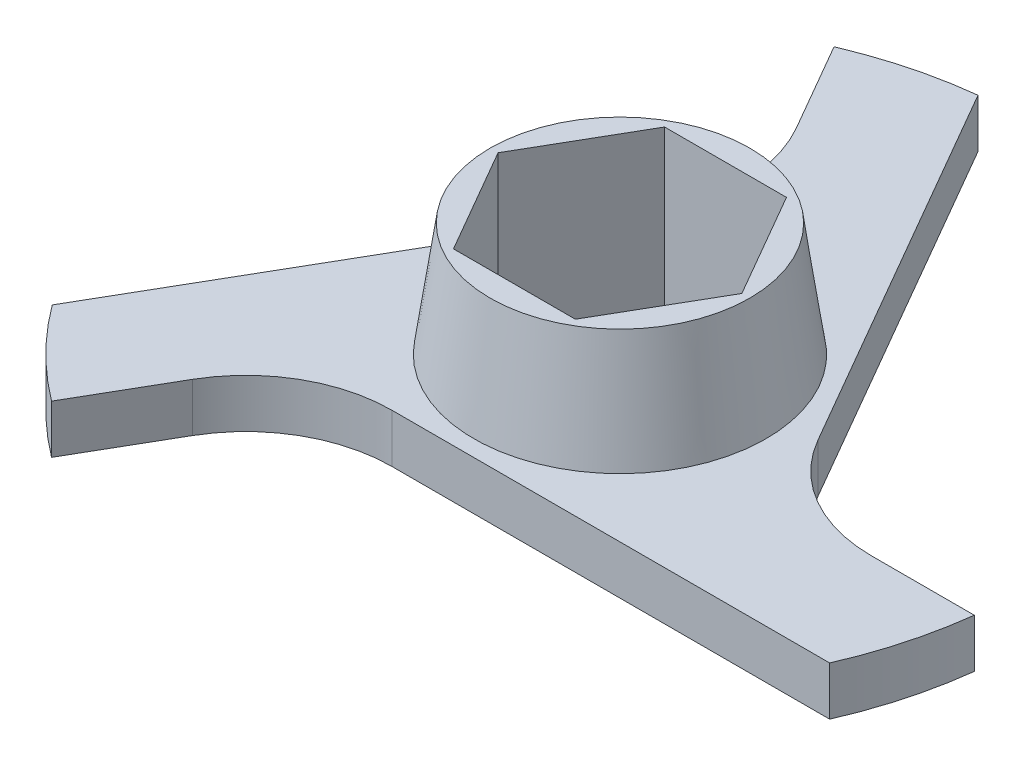
ISO-10303-21;
HEADER;
FILE_DESCRIPTION(('STEP AP214'),'2;1');
FILE_NAME('part.step','',(''),(''),'','','');
FILE_SCHEMA(('AUTOMOTIVE_DESIGN { 1 0 10303 214 1 1 1 1 }'));
ENDSEC;
DATA;
#1=APPLICATION_CONTEXT('core data for automotive mechanical design processes');
#2=APPLICATION_PROTOCOL_DEFINITION('international standard','automotive_design',2000,#1);
#3=PRODUCT_CONTEXT('',#1,'mechanical');
#4=PRODUCT('Part','Part','',(#3));
#5=PRODUCT_RELATED_PRODUCT_CATEGORY('part','',(#4));
#6=PRODUCT_DEFINITION_FORMATION('','',#4);
#7=PRODUCT_DEFINITION_CONTEXT('part definition',#1,'design');
#8=PRODUCT_DEFINITION('design','',#6,#7);
#9=PRODUCT_DEFINITION_SHAPE('','',#8);
#10=(LENGTH_UNIT() NAMED_UNIT(*) SI_UNIT(.MILLI.,.METRE.));
#11=(NAMED_UNIT(*) PLANE_ANGLE_UNIT() SI_UNIT($,.RADIAN.));
#12=(NAMED_UNIT(*) SI_UNIT($,.STERADIAN.) SOLID_ANGLE_UNIT());
#13=UNCERTAINTY_MEASURE_WITH_UNIT(LENGTH_MEASURE(1.E-05),#10,'distance_accuracy_value','');
#14=(GEOMETRIC_REPRESENTATION_CONTEXT(3) GLOBAL_UNCERTAINTY_ASSIGNED_CONTEXT((#13)) GLOBAL_UNIT_ASSIGNED_CONTEXT((#10,
#11,#12)) REPRESENTATION_CONTEXT('',''));
#15=CARTESIAN_POINT('',(0.,0.,0.));
#16=DIRECTION('',(0.,0.,1.));
#17=DIRECTION('',(1.,0.,0.));
#18=AXIS2_PLACEMENT_3D('',#15,#16,#17);
#19=CARTESIAN_POINT('',(0.,10.,0.));
#20=DIRECTION('',(0.,1.,0.));
#21=DIRECTION('',(0.,0.,1.));
#22=AXIS2_PLACEMENT_3D('',#19,#20,#21);
#23=PLANE('',#22);
#24=DIRECTION('',(-0.5,0.,-0.866025403784438));
#25=VECTOR('',#24,1.);
#26=CARTESIAN_POINT('',(7.50555349946514,10.,0.));
#27=LINE('',#26,#25);
#28=CARTESIAN_POINT('',(7.50555349946514,10.,0.));
#29=VERTEX_POINT('',#28);
#30=CARTESIAN_POINT('',(3.75277674973257,10.,-6.5));
#31=VERTEX_POINT('',#30);
#32=EDGE_CURVE('E59',#29,#31,#27,.T.);
#33=ORIENTED_EDGE('',*,*,#32,.F.);
#34=DIRECTION('',(0.5,0.,-0.866025403784438));
#35=VECTOR('',#34,1.);
#36=CARTESIAN_POINT('',(3.75277674973257,10.,6.5));
#37=LINE('',#36,#35);
#38=CARTESIAN_POINT('',(3.75277674973257,10.,6.5));
#39=VERTEX_POINT('',#38);
#40=EDGE_CURVE('E296',#39,#29,#37,.T.);
#41=ORIENTED_EDGE('',*,*,#40,.F.);
#42=DIRECTION('',(1.,0.,0.));
#43=VECTOR('',#42,1.);
#44=CARTESIAN_POINT('',(-3.75277674973257,10.,6.5));
#45=LINE('',#44,#43);
#46=CARTESIAN_POINT('',(-3.75277674973257,10.,6.5));
#47=VERTEX_POINT('',#46);
#48=EDGE_CURVE('E293',#47,#39,#45,.T.);
#49=ORIENTED_EDGE('',*,*,#48,.F.);
#50=DIRECTION('',(0.5,0.,0.866025403784439));
#51=VECTOR('',#50,1.);
#52=CARTESIAN_POINT('',(-7.50555349946514,10.,0.));
#53=LINE('',#52,#51);
#54=CARTESIAN_POINT('',(-7.50555349946514,10.,0.));
#55=VERTEX_POINT('',#54);
#56=EDGE_CURVE('E290',#55,#47,#53,.T.);
#57=ORIENTED_EDGE('',*,*,#56,.F.);
#58=DIRECTION('',(-0.5,0.,0.866025403784439));
#59=VECTOR('',#58,1.);
#60=CARTESIAN_POINT('',(-3.75277674973257,10.,-6.5));
#61=LINE('',#60,#59);
#62=CARTESIAN_POINT('',(-3.75277674973257,10.,-6.5));
#63=VERTEX_POINT('',#62);
#64=EDGE_CURVE('E287',#63,#55,#61,.T.);
#65=ORIENTED_EDGE('',*,*,#64,.F.);
#66=DIRECTION('',(-1.,0.,0.));
#67=VECTOR('',#66,1.);
#68=CARTESIAN_POINT('',(3.75277674973257,10.,-6.5));
#69=LINE('',#68,#67);
#70=EDGE_CURVE('E284',#31,#63,#69,.T.);
#71=ORIENTED_EDGE('',*,*,#70,.F.);
#72=EDGE_LOOP('',(#33,#41,#49,#57,#65,#71));
#73=FACE_BOUND('',#72,.T.);
#74=CARTESIAN_POINT('',(0.,10.,0.));
#75=DIRECTION('',(0.,-1.,0.));
#76=DIRECTION('',(0.,0.,-1.));
#77=AXIS2_PLACEMENT_3D('',#74,#75,#76);
#78=CIRCLE('',#77,8.);
#79=CARTESIAN_POINT('',(0.,10.,-8.));
#80=VERTEX_POINT('',#79);
#81=EDGE_CURVE('E405',#80,#80,#78,.T.);
#82=ORIENTED_EDGE('',*,*,#81,.F.);
#83=EDGE_LOOP('',(#82));
#84=FACE_BOUND('',#83,.T.);
#85=ADVANCED_FACE('F37',(#73,#84),#23,.T.);
#86=CARTESIAN_POINT('',(0.,10.,9.99999999999999));
#87=DIRECTION('',(0.,0.,-1.));
#88=DIRECTION('',(-1.,0.,0.));
#89=AXIS2_PLACEMENT_3D('',#86,#87,#88);
#90=PLANE('',#89);
#91=DIRECTION('',(0.,-1.,0.));
#92=VECTOR('',#91,1.);
#93=CARTESIAN_POINT('',(22.9128784747792,10.,10.0000000000001));
#94=LINE('',#93,#92);
#95=CARTESIAN_POINT('',(22.9128784747792,3.,9.99999999999999));
#96=VERTEX_POINT('',#95);
#97=CARTESIAN_POINT('',(22.9128784747792,0.,10.0000000000001));
#98=VERTEX_POINT('',#97);
#99=EDGE_CURVE('E200',#96,#98,#94,.T.);
#100=ORIENTED_EDGE('',*,*,#99,.F.);
#101=DIRECTION('',(-1.,0.,0.));
#102=VECTOR('',#101,1.);
#103=CARTESIAN_POINT('',(0.,3.,9.99999999999999));
#104=LINE('',#103,#102);
#105=CARTESIAN_POINT('',(-4.04145188432756,3.,9.99999999999996));
#106=VERTEX_POINT('',#105);
#107=EDGE_CURVE('E260',#96,#106,#104,.T.);
#108=ORIENTED_EDGE('',*,*,#107,.T.);
#109=DIRECTION('',(0.,-1.,0.));
#110=VECTOR('',#109,1.);
#111=CARTESIAN_POINT('',(-4.04145188432748,10.,9.99999999999997));
#112=LINE('',#111,#110);
#113=CARTESIAN_POINT('',(-4.04145188432756,0.,9.99999999999999));
#114=VERTEX_POINT('',#113);
#115=EDGE_CURVE('E181',#106,#114,#112,.T.);
#116=ORIENTED_EDGE('',*,*,#115,.T.);
#117=DIRECTION('',(1.,0.,0.));
#118=VECTOR('',#117,1.);
#119=CARTESIAN_POINT('',(0.,0.,9.99999999999999));
#120=LINE('',#119,#118);
#121=EDGE_CURVE('E215',#114,#98,#120,.T.);
#122=ORIENTED_EDGE('',*,*,#121,.T.);
#123=EDGE_LOOP('',(#100,#108,#116,#122));
#124=FACE_BOUND('',#123,.T.);
#125=ADVANCED_FACE('F321',(#124),#90,.F.);
#126=CARTESIAN_POINT('',(8.66025403784439,10.,-5.));
#127=DIRECTION('',(-0.866025403784439,0.,0.5));
#128=DIRECTION('',(0.5,0.,0.866025403784439));
#129=AXIS2_PLACEMENT_3D('',#126,#127,#128);
#130=PLANE('',#129);
#131=DIRECTION('',(0.,-1.,0.));
#132=VECTOR('',#131,1.);
#133=CARTESIAN_POINT('',(-2.79618519954522,10.,-24.8431348329844));
#134=LINE('',#133,#132);
#135=CARTESIAN_POINT('',(-2.79618519954522,3.,-24.8431348329844));
#136=VERTEX_POINT('',#135);
#137=CARTESIAN_POINT('',(-2.79618519954522,0.,-24.8431348329844));
#138=VERTEX_POINT('',#137);
#139=EDGE_CURVE('E226',#136,#138,#134,.T.);
#140=ORIENTED_EDGE('',*,*,#139,.F.);
#141=DIRECTION('',(0.5,0.,0.866025403784439));
#142=VECTOR('',#141,1.);
#143=CARTESIAN_POINT('',(8.66025403784439,3.,-5.));
#144=LINE('',#143,#142);
#145=CARTESIAN_POINT('',(10.6809799800081,3.,-1.49999999999995));
#146=VERTEX_POINT('',#145);
#147=EDGE_CURVE('E257',#136,#146,#144,.T.);
#148=ORIENTED_EDGE('',*,*,#147,.T.);
#149=DIRECTION('',(0.,-1.,0.));
#150=VECTOR('',#149,1.);
#151=CARTESIAN_POINT('',(10.6809799800081,10.,-1.49999999999995));
#152=LINE('',#151,#150);
#153=CARTESIAN_POINT('',(10.6809799800081,0.,-1.49999999999995));
#154=VERTEX_POINT('',#153);
#155=EDGE_CURVE('E202',#146,#154,#152,.T.);
#156=ORIENTED_EDGE('',*,*,#155,.T.);
#157=DIRECTION('',(-0.5,0.,-0.866025403784439));
#158=VECTOR('',#157,1.);
#159=CARTESIAN_POINT('',(8.66025403784439,0.,-5.));
#160=LINE('',#159,#158);
#161=EDGE_CURVE('E218',#154,#138,#160,.T.);
#162=ORIENTED_EDGE('',*,*,#161,.T.);
#163=EDGE_LOOP('',(#140,#148,#156,#162));
#164=FACE_BOUND('',#163,.T.);
#165=ADVANCED_FACE('F337',(#164),#130,.F.);
#166=CARTESIAN_POINT('',(2.59807621135332,10.,-1.5));
#167=DIRECTION('',(-0.866025403784438,0.,0.5));
#168=DIRECTION('',(0.5,0.,0.866025403784438));
#169=AXIS2_PLACEMENT_3D('',#166,#167,#168);
#170=PLANE('',#169);
#171=DIRECTION('',(0.5,0.,0.866025403784438));
#172=VECTOR('',#171,1.);
#173=CARTESIAN_POINT('',(2.59807621135332,3.,-1.5));
#174=LINE('',#173,#172);
#175=CARTESIAN_POINT('',(-9.81159743463755,3.,-22.9941852602047));
#176=VERTEX_POINT('',#175);
#177=CARTESIAN_POINT('',(-6.63952809568069,3.,-17.5));
#178=VERTEX_POINT('',#177);
#179=EDGE_CURVE('E247',#176,#178,#174,.T.);
#180=ORIENTED_EDGE('',*,*,#179,.F.);
#181=DIRECTION('',(0.,-1.,0.));
#182=VECTOR('',#181,1.);
#183=CARTESIAN_POINT('',(-9.81159743463755,10.,-22.9941852602047));
#184=LINE('',#183,#182);
#185=CARTESIAN_POINT('',(-9.81159743463755,0.,-22.9941852602047));
#186=VERTEX_POINT('',#185);
#187=EDGE_CURVE('E224',#176,#186,#184,.T.);
#188=ORIENTED_EDGE('',*,*,#187,.T.);
#189=DIRECTION('',(-0.5,0.,-0.866025403784438));
#190=VECTOR('',#189,1.);
#191=CARTESIAN_POINT('',(2.59807621135332,0.,-1.5));
#192=LINE('',#191,#190);
#193=CARTESIAN_POINT('',(-6.6395280956807,0.,-17.5));
#194=VERTEX_POINT('',#193);
#195=EDGE_CURVE('E206',#194,#186,#192,.T.);
#196=ORIENTED_EDGE('',*,*,#195,.F.);
#197=DIRECTION('',(0.,-1.,0.));
#198=VECTOR('',#197,1.);
#199=CARTESIAN_POINT('',(-6.6395280956807,10.,-17.5));
#200=LINE('',#199,#198);
#201=EDGE_CURVE('E45',#178,#194,#200,.T.);
#202=ORIENTED_EDGE('',*,*,#201,.F.);
#203=EDGE_LOOP('',(#180,#188,#196,#202));
#204=FACE_BOUND('',#203,.T.);
#205=ADVANCED_FACE('F39',(#204),#170,.T.);
#206=CARTESIAN_POINT('',(-14.4337567297406,10.,-13.));
#207=DIRECTION('',(0.,-1.,0.));
#208=DIRECTION('',(0.,0.,-1.));
#209=AXIS2_PLACEMENT_3D('',#206,#207,#208);
#210=CYLINDRICAL_SURFACE('',#209,9.);
#211=CARTESIAN_POINT('',(-14.4337567297406,3.,-13.));
#212=DIRECTION('',(0.,-1.,0.));
#213=DIRECTION('',(0.,0.,-1.));
#214=AXIS2_PLACEMENT_3D('',#211,#212,#213);
#215=CIRCLE('',#214,9.);
#216=CARTESIAN_POINT('',(-6.6395280956807,3.,-8.5));
#217=VERTEX_POINT('',#216);
#218=EDGE_CURVE('E236',#178,#217,#215,.T.);
#219=ORIENTED_EDGE('',*,*,#218,.F.);
#220=ORIENTED_EDGE('',*,*,#201,.T.);
#221=CARTESIAN_POINT('',(-14.4337567297406,0.,-13.));
#222=DIRECTION('',(0.,1.,0.));
#223=DIRECTION('',(0.,0.,1.));
#224=AXIS2_PLACEMENT_3D('',#221,#222,#223);
#225=CIRCLE('',#224,9.);
#226=CARTESIAN_POINT('',(-6.6395280956807,0.,-8.5));
#227=VERTEX_POINT('',#226);
#228=EDGE_CURVE('E209',#227,#194,#225,.T.);
#229=ORIENTED_EDGE('',*,*,#228,.F.);
#230=DIRECTION('',(0.,-1.,0.));
#231=VECTOR('',#230,1.);
#232=CARTESIAN_POINT('',(-6.6395280956807,10.,-8.5));
#233=LINE('',#232,#231);
#234=EDGE_CURVE('E228',#217,#227,#233,.T.);
#235=ORIENTED_EDGE('',*,*,#234,.F.);
#236=EDGE_LOOP('',(#219,#220,#229,#235));
#237=FACE_BOUND('',#236,.T.);
#238=ADVANCED_FACE('F234',(#237),#210,.F.);
#239=CARTESIAN_POINT('',(-8.66025403784439,10.,-5.00000000000001));
#240=DIRECTION('',(0.866025403784438,0.,0.5));
#241=DIRECTION('',(0.5,0.,-0.866025403784438));
#242=AXIS2_PLACEMENT_3D('',#239,#240,#241);
#243=PLANE('',#242);
#244=DIRECTION('',(0.,-1.,0.));
#245=VECTOR('',#244,1.);
#246=CARTESIAN_POINT('',(-20.1166932752341,10.,14.8431348329843));
#247=LINE('',#246,#245);
#248=CARTESIAN_POINT('',(-20.1166932752341,3.,14.8431348329843));
#249=VERTEX_POINT('',#248);
#250=CARTESIAN_POINT('',(-20.1166932752341,0.,14.8431348329843));
#251=VERTEX_POINT('',#250);
#252=EDGE_CURVE('E179',#249,#251,#247,.T.);
#253=ORIENTED_EDGE('',*,*,#252,.F.);
#254=DIRECTION('',(0.5,0.,-0.866025403784438));
#255=VECTOR('',#254,1.);
#256=CARTESIAN_POINT('',(-8.66025403784439,3.,-5.00000000000001));
#257=LINE('',#256,#255);
#258=EDGE_CURVE('E52',#249,#217,#257,.T.);
#259=ORIENTED_EDGE('',*,*,#258,.T.);
#260=ORIENTED_EDGE('',*,*,#234,.T.);
#261=DIRECTION('',(-0.5,0.,0.866025403784438));
#262=VECTOR('',#261,1.);
#263=CARTESIAN_POINT('',(-8.66025403784439,0.,-5.00000000000001));
#264=LINE('',#263,#262);
#265=EDGE_CURVE('E212',#227,#251,#264,.T.);
#266=ORIENTED_EDGE('',*,*,#265,.T.);
#267=EDGE_LOOP('',(#253,#259,#260,#266));
#268=FACE_BOUND('',#267,.T.);
#269=ADVANCED_FACE('F245',(#268),#243,.F.);
#270=CARTESIAN_POINT('',(0.,10.,0.));
#271=DIRECTION('',(0.,-1.,0.));
#272=DIRECTION('',(0.,0.,-1.));
#273=AXIS2_PLACEMENT_3D('',#270,#271,#272);
#274=CYLINDRICAL_SURFACE('',#273,25.);
#275=ORIENTED_EDGE('',*,*,#187,.F.);
#276=CARTESIAN_POINT('',(0.,3.,0.));
#277=DIRECTION('',(0.,-1.,0.));
#278=DIRECTION('',(0.,0.,-1.));
#279=AXIS2_PLACEMENT_3D('',#276,#277,#278);
#280=CIRCLE('',#279,25.);
#281=EDGE_CURVE('E254',#176,#136,#280,.T.);
#282=ORIENTED_EDGE('',*,*,#281,.T.);
#283=ORIENTED_EDGE('',*,*,#139,.T.);
#284=CARTESIAN_POINT('',(0.,0.,0.));
#285=DIRECTION('',(0.,1.,0.));
#286=DIRECTION('',(0.,0.,1.));
#287=AXIS2_PLACEMENT_3D('',#284,#285,#286);
#288=CIRCLE('',#287,25.);
#289=EDGE_CURVE('E221',#138,#186,#288,.T.);
#290=ORIENTED_EDGE('',*,*,#289,.T.);
#291=EDGE_LOOP('',(#275,#282,#283,#290));
#292=FACE_BOUND('',#291,.T.);
#293=ADVANCED_FACE('F340',(#292),#274,.T.);
#294=CARTESIAN_POINT('',(0.,0.,0.));
#295=DIRECTION('',(0.,1.,0.));
#296=DIRECTION('',(0.,0.,1.));
#297=AXIS2_PLACEMENT_3D('',#294,#295,#296);
#298=PLANE('',#297);
#299=DIRECTION('',(-0.5,0.,0.866025403784439));
#300=VECTOR('',#299,1.);
#301=CARTESIAN_POINT('',(3.75277674973257,0.,6.5));
#302=LINE('',#301,#300);
#303=CARTESIAN_POINT('',(7.50555349946514,0.,0.));
#304=VERTEX_POINT('',#303);
#305=CARTESIAN_POINT('',(3.75277674973257,0.,6.5));
#306=VERTEX_POINT('',#305);
#307=EDGE_CURVE('E278',#304,#306,#302,.T.);
#308=ORIENTED_EDGE('',*,*,#307,.F.);
#309=DIRECTION('',(0.5,0.,0.866025403784439));
#310=VECTOR('',#309,1.);
#311=CARTESIAN_POINT('',(7.50555349946514,0.,0.));
#312=LINE('',#311,#310);
#313=CARTESIAN_POINT('',(3.75277674973257,0.,-6.5));
#314=VERTEX_POINT('',#313);
#315=EDGE_CURVE('E280',#314,#304,#312,.T.);
#316=ORIENTED_EDGE('',*,*,#315,.F.);
#317=DIRECTION('',(1.,0.,0.));
#318=VECTOR('',#317,1.);
#319=CARTESIAN_POINT('',(3.75277674973257,0.,-6.5));
#320=LINE('',#319,#318);
#321=CARTESIAN_POINT('',(-3.75277674973257,0.,-6.5));
#322=VERTEX_POINT('',#321);
#323=EDGE_CURVE('E282',#322,#314,#320,.T.);
#324=ORIENTED_EDGE('',*,*,#323,.F.);
#325=DIRECTION('',(0.5,0.,-0.866025403784439));
#326=VECTOR('',#325,1.);
#327=CARTESIAN_POINT('',(-3.75277674973257,0.,-6.5));
#328=LINE('',#327,#326);
#329=CARTESIAN_POINT('',(-7.50555349946514,0.,0.));
#330=VERTEX_POINT('',#329);
#331=EDGE_CURVE('E270',#330,#322,#328,.T.);
#332=ORIENTED_EDGE('',*,*,#331,.F.);
#333=DIRECTION('',(-0.5,0.,-0.866025403784439));
#334=VECTOR('',#333,1.);
#335=CARTESIAN_POINT('',(-7.50555349946514,0.,0.));
#336=LINE('',#335,#334);
#337=CARTESIAN_POINT('',(-3.75277674973257,0.,6.5));
#338=VERTEX_POINT('',#337);
#339=EDGE_CURVE('E273',#338,#330,#336,.T.);
#340=ORIENTED_EDGE('',*,*,#339,.F.);
#341=DIRECTION('',(-1.,0.,0.));
#342=VECTOR('',#341,1.);
#343=CARTESIAN_POINT('',(-3.75277674973257,0.,6.5));
#344=LINE('',#343,#342);
#345=EDGE_CURVE('E276',#306,#338,#344,.T.);
#346=ORIENTED_EDGE('',*,*,#345,.F.);
#347=EDGE_LOOP('',(#308,#316,#324,#332,#340,#346));
#348=FACE_BOUND('',#347,.T.);
#349=ORIENTED_EDGE('',*,*,#289,.F.);
#350=ORIENTED_EDGE('',*,*,#161,.F.);
#351=CARTESIAN_POINT('',(18.4752086140681,0.,-5.99999999999991));
#352=DIRECTION('',(0.,1.,0.));
#353=DIRECTION('',(-0.866025403784436,0.,-0.500000000000004));
#354=AXIS2_PLACEMENT_3D('',#351,#352,#353);
#355=CIRCLE('',#354,9.);
#356=CARTESIAN_POINT('',(18.475208614068,0.,3.00000000000009));
#357=VERTEX_POINT('',#356);
#358=EDGE_CURVE('E192',#154,#357,#355,.T.);
#359=ORIENTED_EDGE('',*,*,#358,.T.);
#360=DIRECTION('',(1.,0.,0.));
#361=VECTOR('',#360,1.);
#362=CARTESIAN_POINT('',(0.,0.,3.00000000000001));
#363=LINE('',#362,#361);
#364=CARTESIAN_POINT('',(24.8193472919817,0.,3.00000000000011));
#365=VERTEX_POINT('',#364);
#366=EDGE_CURVE('E189',#357,#365,#363,.T.);
#367=ORIENTED_EDGE('',*,*,#366,.T.);
#368=CARTESIAN_POINT('',(0.,0.,0.));
#369=DIRECTION('',(0.,1.,0.));
#370=DIRECTION('',(-0.866025403784436,0.,-0.500000000000004));
#371=AXIS2_PLACEMENT_3D('',#368,#369,#370);
#372=CIRCLE('',#371,25.);
#373=EDGE_CURVE('E195',#98,#365,#372,.T.);
#374=ORIENTED_EDGE('',*,*,#373,.F.);
#375=ORIENTED_EDGE('',*,*,#121,.F.);
#376=CARTESIAN_POINT('',(-4.04145188432756,0.,19.));
#377=DIRECTION('',(0.,1.,0.));
#378=DIRECTION('',(0.866025403784443,0.,-0.499999999999992));
#379=AXIS2_PLACEMENT_3D('',#376,#377,#378);
#380=CIRCLE('',#379,9.);
#381=CARTESIAN_POINT('',(-11.8356805183875,0.,14.4999999999999));
#382=VERTEX_POINT('',#381);
#383=EDGE_CURVE('E183',#114,#382,#380,.T.);
#384=ORIENTED_EDGE('',*,*,#383,.T.);
#385=DIRECTION('',(-0.500000000000008,0.,0.866025403784434));
#386=VECTOR('',#385,1.);
#387=CARTESIAN_POINT('',(-2.59807621135331,0.,-1.50000000000003));
#388=LINE('',#387,#386);
#389=CARTESIAN_POINT('',(-15.0077498573444,0.,19.9941852602045));
#390=VERTEX_POINT('',#389);
#391=EDGE_CURVE('E311',#382,#390,#388,.T.);
#392=ORIENTED_EDGE('',*,*,#391,.T.);
#393=CARTESIAN_POINT('',(0.,0.,0.));
#394=DIRECTION('',(0.,1.,0.));
#395=DIRECTION('',(0.866025403784443,0.,-0.499999999999992));
#396=AXIS2_PLACEMENT_3D('',#393,#394,#395);
#397=CIRCLE('',#396,25.);
#398=EDGE_CURVE('E177',#251,#390,#397,.T.);
#399=ORIENTED_EDGE('',*,*,#398,.F.);
#400=ORIENTED_EDGE('',*,*,#265,.F.);
#401=ORIENTED_EDGE('',*,*,#228,.T.);
#402=ORIENTED_EDGE('',*,*,#195,.T.);
#403=EDGE_LOOP('',(#349,#350,#359,#367,#374,#375,#384,#392,#399,#400,#401,#402));
#404=FACE_BOUND('',#403,.T.);
#405=ADVANCED_FACE('F243',(#348,#404),#298,.F.);
#406=CARTESIAN_POINT('',(0.,10.,0.));
#407=DIRECTION('',(0.,-1.,0.));
#408=DIRECTION('',(0.,0.,-1.));
#409=AXIS2_PLACEMENT_3D('',#406,#407,#408);
#410=CYLINDRICAL_SURFACE('',#409,25.);
#411=DIRECTION('',(0.,-1.,0.));
#412=VECTOR('',#411,1.);
#413=CARTESIAN_POINT('',(24.8193472919817,10.,3.00000000000011));
#414=LINE('',#413,#412);
#415=CARTESIAN_POINT('',(24.8193472919817,3.,3.00000000000011));
#416=VERTEX_POINT('',#415);
#417=EDGE_CURVE('E198',#416,#365,#414,.T.);
#418=ORIENTED_EDGE('',*,*,#417,.F.);
#419=CARTESIAN_POINT('',(0.,3.,0.));
#420=DIRECTION('',(0.,-1.,0.));
#421=DIRECTION('',(0.,0.,-1.));
#422=AXIS2_PLACEMENT_3D('',#419,#420,#421);
#423=CIRCLE('',#422,25.);
#424=EDGE_CURVE('E267',#416,#96,#423,.T.);
#425=ORIENTED_EDGE('',*,*,#424,.T.);
#426=ORIENTED_EDGE('',*,*,#99,.T.);
#427=ORIENTED_EDGE('',*,*,#373,.T.);
#428=EDGE_LOOP('',(#418,#425,#426,#427));
#429=FACE_BOUND('',#428,.T.);
#430=ADVANCED_FACE('F324',(#429),#410,.T.);
#431=CARTESIAN_POINT('',(0.,10.,3.00000000000001));
#432=DIRECTION('',(0.,0.,-1.));
#433=DIRECTION('',(-1.,0.,0.));
#434=AXIS2_PLACEMENT_3D('',#431,#432,#433);
#435=PLANE('',#434);
#436=DIRECTION('',(-1.,0.,0.));
#437=VECTOR('',#436,1.);
#438=CARTESIAN_POINT('',(0.,3.,3.00000000000001));
#439=LINE('',#438,#437);
#440=CARTESIAN_POINT('',(18.475208614068,3.,3.00000000000009));
#441=VERTEX_POINT('',#440);
#442=EDGE_CURVE('E265',#416,#441,#439,.T.);
#443=ORIENTED_EDGE('',*,*,#442,.F.);
#444=ORIENTED_EDGE('',*,*,#417,.T.);
#445=ORIENTED_EDGE('',*,*,#366,.F.);
#446=DIRECTION('',(0.,-1.,0.));
#447=VECTOR('',#446,1.);
#448=CARTESIAN_POINT('',(18.475208614068,10.,3.00000000000009));
#449=LINE('',#448,#447);
#450=EDGE_CURVE('E204',#441,#357,#449,.T.);
#451=ORIENTED_EDGE('',*,*,#450,.F.);
#452=EDGE_LOOP('',(#443,#444,#445,#451));
#453=FACE_BOUND('',#452,.T.);
#454=ADVANCED_FACE('F329',(#453),#435,.T.);
#455=CARTESIAN_POINT('',(18.4752086140681,10.,-5.99999999999991));
#456=DIRECTION('',(0.,-1.,0.));
#457=DIRECTION('',(0.,0.,-1.));
#458=AXIS2_PLACEMENT_3D('',#455,#456,#457);
#459=CYLINDRICAL_SURFACE('',#458,9.);
#460=CARTESIAN_POINT('',(18.4752086140681,3.,-5.99999999999991));
#461=DIRECTION('',(0.,-1.,0.));
#462=DIRECTION('',(0.,0.,-1.));
#463=AXIS2_PLACEMENT_3D('',#460,#461,#462);
#464=CIRCLE('',#463,9.);
#465=EDGE_CURVE('E263',#441,#146,#464,.T.);
#466=ORIENTED_EDGE('',*,*,#465,.F.);
#467=ORIENTED_EDGE('',*,*,#450,.T.);
#468=ORIENTED_EDGE('',*,*,#358,.F.);
#469=ORIENTED_EDGE('',*,*,#155,.F.);
#470=EDGE_LOOP('',(#466,#467,#468,#469));
#471=FACE_BOUND('',#470,.T.);
#472=ADVANCED_FACE('F333',(#471),#459,.F.);
#473=CARTESIAN_POINT('',(-2.59807621135331,10.,-1.50000000000003));
#474=DIRECTION('',(0.866025403784434,0.,0.500000000000008));
#475=DIRECTION('',(0.500000000000008,0.,-0.866025403784434));
#476=AXIS2_PLACEMENT_3D('',#473,#474,#475);
#477=PLANE('',#476);
#478=DIRECTION('',(0.500000000000008,0.,-0.866025403784434));
#479=VECTOR('',#478,1.);
#480=CARTESIAN_POINT('',(-2.59807621135331,3.,-1.50000000000003));
#481=LINE('',#480,#479);
#482=CARTESIAN_POINT('',(-15.0077498573444,3.,19.9941852602045));
#483=VERTEX_POINT('',#482);
#484=CARTESIAN_POINT('',(-11.8356805183875,3.,14.4999999999999));
#485=VERTEX_POINT('',#484);
#486=EDGE_CURVE('E161',#483,#485,#481,.T.);
#487=ORIENTED_EDGE('',*,*,#486,.F.);
#488=DIRECTION('',(0.,-1.,0.));
#489=VECTOR('',#488,1.);
#490=CARTESIAN_POINT('',(-15.0077498573444,10.,19.9941852602045));
#491=LINE('',#490,#489);
#492=EDGE_CURVE('E170',#483,#390,#491,.T.);
#493=ORIENTED_EDGE('',*,*,#492,.T.);
#494=ORIENTED_EDGE('',*,*,#391,.F.);
#495=DIRECTION('',(0.,-1.,0.));
#496=VECTOR('',#495,1.);
#497=CARTESIAN_POINT('',(-11.8356805183875,10.,14.4999999999999));
#498=LINE('',#497,#496);
#499=EDGE_CURVE('E172',#485,#382,#498,.T.);
#500=ORIENTED_EDGE('',*,*,#499,.F.);
#501=EDGE_LOOP('',(#487,#493,#494,#500));
#502=FACE_BOUND('',#501,.T.);
#503=ADVANCED_FACE('F168',(#502),#477,.T.);
#504=CARTESIAN_POINT('',(-4.04145188432756,10.,19.));
#505=DIRECTION('',(0.,-1.,0.));
#506=DIRECTION('',(0.,0.,-1.));
#507=AXIS2_PLACEMENT_3D('',#504,#505,#506);
#508=CYLINDRICAL_SURFACE('',#507,9.);
#509=CARTESIAN_POINT('',(-4.04145188432756,3.,19.));
#510=DIRECTION('',(0.,-1.,0.));
#511=DIRECTION('',(0.,0.,-1.));
#512=AXIS2_PLACEMENT_3D('',#509,#510,#511);
#513=CIRCLE('',#512,9.);
#514=EDGE_CURVE('E252',#485,#106,#513,.T.);
#515=ORIENTED_EDGE('',*,*,#514,.F.);
#516=ORIENTED_EDGE('',*,*,#499,.T.);
#517=ORIENTED_EDGE('',*,*,#383,.F.);
#518=ORIENTED_EDGE('',*,*,#115,.F.);
#519=EDGE_LOOP('',(#515,#516,#517,#518));
#520=FACE_BOUND('',#519,.T.);
#521=ADVANCED_FACE('F318',(#520),#508,.F.);
#522=CARTESIAN_POINT('',(0.,10.,0.));
#523=DIRECTION('',(0.,-1.,0.));
#524=DIRECTION('',(0.,0.,-1.));
#525=AXIS2_PLACEMENT_3D('',#522,#523,#524);
#526=CYLINDRICAL_SURFACE('',#525,25.);
#527=ORIENTED_EDGE('',*,*,#492,.F.);
#528=CARTESIAN_POINT('',(0.,3.,0.));
#529=DIRECTION('',(0.,-1.,0.));
#530=DIRECTION('',(0.,0.,-1.));
#531=AXIS2_PLACEMENT_3D('',#528,#529,#530);
#532=CIRCLE('',#531,25.);
#533=EDGE_CURVE('E11',#483,#249,#532,.T.);
#534=ORIENTED_EDGE('',*,*,#533,.T.);
#535=ORIENTED_EDGE('',*,*,#252,.T.);
#536=ORIENTED_EDGE('',*,*,#398,.T.);
#537=EDGE_LOOP('',(#527,#534,#535,#536));
#538=FACE_BOUND('',#537,.T.);
#539=ADVANCED_FACE('F175',(#538),#526,.T.);
#540=CARTESIAN_POINT('',(7.50555349946514,-19.8578280114753,0.));
#541=DIRECTION('',(0.866025403784438,0.,-0.5));
#542=DIRECTION('',(-0.5,0.,-0.866025403784439));
#543=AXIS2_PLACEMENT_3D('',#540,#541,#542);
#544=PLANE('',#543);
#545=ORIENTED_EDGE('',*,*,#315,.T.);
#546=DIRECTION('',(0.,1.,0.));
#547=VECTOR('',#546,1.);
#548=CARTESIAN_POINT('',(7.50555349946514,-19.8578280114753,0.));
#549=LINE('',#548,#547);
#550=EDGE_CURVE('E274',#304,#29,#549,.T.);
#551=ORIENTED_EDGE('',*,*,#550,.T.);
#552=ORIENTED_EDGE('',*,*,#32,.T.);
#553=DIRECTION('',(0.,1.,0.));
#554=VECTOR('',#553,1.);
#555=CARTESIAN_POINT('',(3.75277674973257,-19.8578280114753,-6.5));
#556=LINE('',#555,#554);
#557=EDGE_CURVE('E299',#314,#31,#556,.T.);
#558=ORIENTED_EDGE('',*,*,#557,.F.);
#559=EDGE_LOOP('',(#545,#551,#552,#558));
#560=FACE_BOUND('',#559,.T.);
#561=ADVANCED_FACE('F372',(#560),#544,.F.);
#562=CARTESIAN_POINT('',(3.75277674973257,-19.8578280114753,6.5));
#563=DIRECTION('',(0.866025403784438,0.,0.5));
#564=DIRECTION('',(0.5,0.,-0.866025403784439));
#565=AXIS2_PLACEMENT_3D('',#562,#563,#564);
#566=PLANE('',#565);
#567=ORIENTED_EDGE('',*,*,#307,.T.);
#568=DIRECTION('',(0.,1.,0.));
#569=VECTOR('',#568,1.);
#570=CARTESIAN_POINT('',(3.75277674973257,-19.8578280114753,6.5));
#571=LINE('',#570,#569);
#572=EDGE_CURVE('E301',#306,#39,#571,.T.);
#573=ORIENTED_EDGE('',*,*,#572,.T.);
#574=ORIENTED_EDGE('',*,*,#40,.T.);
#575=ORIENTED_EDGE('',*,*,#550,.F.);
#576=EDGE_LOOP('',(#567,#573,#574,#575));
#577=FACE_BOUND('',#576,.T.);
#578=ADVANCED_FACE('F375',(#577),#566,.F.);
#579=CARTESIAN_POINT('',(-3.75277674973257,-19.8578280114753,6.5));
#580=DIRECTION('',(0.,0.,1.));
#581=DIRECTION('',(1.,0.,0.));
#582=AXIS2_PLACEMENT_3D('',#579,#580,#581);
#583=PLANE('',#582);
#584=ORIENTED_EDGE('',*,*,#345,.T.);
#585=DIRECTION('',(0.,1.,0.));
#586=VECTOR('',#585,1.);
#587=CARTESIAN_POINT('',(-3.75277674973257,-19.8578280114753,6.5));
#588=LINE('',#587,#586);
#589=EDGE_CURVE('E303',#338,#47,#588,.T.);
#590=ORIENTED_EDGE('',*,*,#589,.T.);
#591=ORIENTED_EDGE('',*,*,#48,.T.);
#592=ORIENTED_EDGE('',*,*,#572,.F.);
#593=EDGE_LOOP('',(#584,#590,#591,#592));
#594=FACE_BOUND('',#593,.T.);
#595=ADVANCED_FACE('F387',(#594),#583,.F.);
#596=CARTESIAN_POINT('',(-7.50555349946514,-19.8578280114753,0.));
#597=DIRECTION('',(-0.866025403784439,0.,0.5));
#598=DIRECTION('',(0.5,0.,0.866025403784439));
#599=AXIS2_PLACEMENT_3D('',#596,#597,#598);
#600=PLANE('',#599);
#601=ORIENTED_EDGE('',*,*,#339,.T.);
#602=DIRECTION('',(0.,1.,0.));
#603=VECTOR('',#602,1.);
#604=CARTESIAN_POINT('',(-7.50555349946514,-19.8578280114753,0.));
#605=LINE('',#604,#603);
#606=EDGE_CURVE('E305',#330,#55,#605,.T.);
#607=ORIENTED_EDGE('',*,*,#606,.T.);
#608=ORIENTED_EDGE('',*,*,#56,.T.);
#609=ORIENTED_EDGE('',*,*,#589,.F.);
#610=EDGE_LOOP('',(#601,#607,#608,#609));
#611=FACE_BOUND('',#610,.T.);
#612=ADVANCED_FACE('F383',(#611),#600,.F.);
#613=CARTESIAN_POINT('',(-3.75277674973257,-19.8578280114753,-6.5));
#614=DIRECTION('',(-0.866025403784439,0.,-0.5));
#615=DIRECTION('',(-0.5,0.,0.866025403784439));
#616=AXIS2_PLACEMENT_3D('',#613,#614,#615);
#617=PLANE('',#616);
#618=ORIENTED_EDGE('',*,*,#331,.T.);
#619=DIRECTION('',(0.,1.,0.));
#620=VECTOR('',#619,1.);
#621=CARTESIAN_POINT('',(-3.75277674973257,-19.8578280114753,-6.5));
#622=LINE('',#621,#620);
#623=EDGE_CURVE('E307',#322,#63,#622,.T.);
#624=ORIENTED_EDGE('',*,*,#623,.T.);
#625=ORIENTED_EDGE('',*,*,#64,.T.);
#626=ORIENTED_EDGE('',*,*,#606,.F.);
#627=EDGE_LOOP('',(#618,#624,#625,#626));
#628=FACE_BOUND('',#627,.T.);
#629=ADVANCED_FACE('F379',(#628),#617,.F.);
#630=CARTESIAN_POINT('',(3.75277674973257,-19.8578280114753,-6.5));
#631=DIRECTION('',(0.,0.,-1.));
#632=DIRECTION('',(-1.,0.,0.));
#633=AXIS2_PLACEMENT_3D('',#630,#631,#632);
#634=PLANE('',#633);
#635=ORIENTED_EDGE('',*,*,#323,.T.);
#636=ORIENTED_EDGE('',*,*,#557,.T.);
#637=ORIENTED_EDGE('',*,*,#70,.T.);
#638=ORIENTED_EDGE('',*,*,#623,.F.);
#639=EDGE_LOOP('',(#635,#636,#637,#638));
#640=FACE_BOUND('',#639,.T.);
#641=ADVANCED_FACE('F376',(#640),#634,.F.);
#642=CARTESIAN_POINT('',(9.,3.,0.));
#643=DIRECTION('',(0.,-1.,0.));
#644=DIRECTION('',(0.,0.,-1.));
#645=AXIS2_PLACEMENT_3D('',#642,#643,#644);
#646=PLANE('',#645);
#647=CARTESIAN_POINT('',(0.,3.,0.));
#648=DIRECTION('',(0.,-1.,0.));
#649=DIRECTION('',(0.,0.,-1.));
#650=AXIS2_PLACEMENT_3D('',#647,#648,#649);
#651=CIRCLE('',#650,9.);
#652=CARTESIAN_POINT('',(0.,3.,-9.));
#653=VERTEX_POINT('',#652);
#654=EDGE_CURVE('E173',#653,#653,#651,.T.);
#655=ORIENTED_EDGE('',*,*,#654,.T.);
#656=EDGE_LOOP('',(#655));
#657=FACE_BOUND('',#656,.T.);
#658=ORIENTED_EDGE('',*,*,#442,.T.);
#659=ORIENTED_EDGE('',*,*,#465,.T.);
#660=ORIENTED_EDGE('',*,*,#147,.F.);
#661=ORIENTED_EDGE('',*,*,#281,.F.);
#662=ORIENTED_EDGE('',*,*,#179,.T.);
#663=ORIENTED_EDGE('',*,*,#218,.T.);
#664=ORIENTED_EDGE('',*,*,#258,.F.);
#665=ORIENTED_EDGE('',*,*,#533,.F.);
#666=ORIENTED_EDGE('',*,*,#486,.T.);
#667=ORIENTED_EDGE('',*,*,#514,.T.);
#668=ORIENTED_EDGE('',*,*,#107,.F.);
#669=ORIENTED_EDGE('',*,*,#424,.F.);
#670=EDGE_LOOP('',(#658,#659,#660,#661,#662,#663,#664,#665,#666,#667,#668,#669));
#671=FACE_BOUND('',#670,.T.);
#672=ADVANCED_FACE('F160',(#657,#671),#646,.F.);
#673=CARTESIAN_POINT('',(0.,10.,0.));
#674=DIRECTION('',(0.,-1.,0.));
#675=DIRECTION('',(0.,0.,-1.));
#676=AXIS2_PLACEMENT_3D('',#673,#674,#675);
#677=CONICAL_SURFACE('',#676,8.,0.141897054604164);
#678=ORIENTED_EDGE('',*,*,#654,.F.);
#679=EDGE_LOOP('',(#678));
#680=FACE_BOUND('',#679,.T.);
#681=ORIENTED_EDGE('',*,*,#81,.T.);
#682=EDGE_LOOP('',(#681));
#683=FACE_BOUND('',#682,.T.);
#684=ADVANCED_FACE('F395',(#680,#683),#677,.T.);
#685=CLOSED_SHELL('',(#85,#125,#165,#205,#238,#269,#293,#405,#430,#454,#472,#503,#521,#539,#561,
#578,#595,#612,#629,#641,#672,#684));
#686=MANIFOLD_SOLID_BREP('B2',#685);
#687=ADVANCED_BREP_SHAPE_REPRESENTATION('',(#18,#686),#14);
#688=SHAPE_DEFINITION_REPRESENTATION(#9,#687);
ENDSEC;
END-ISO-10303-21;
